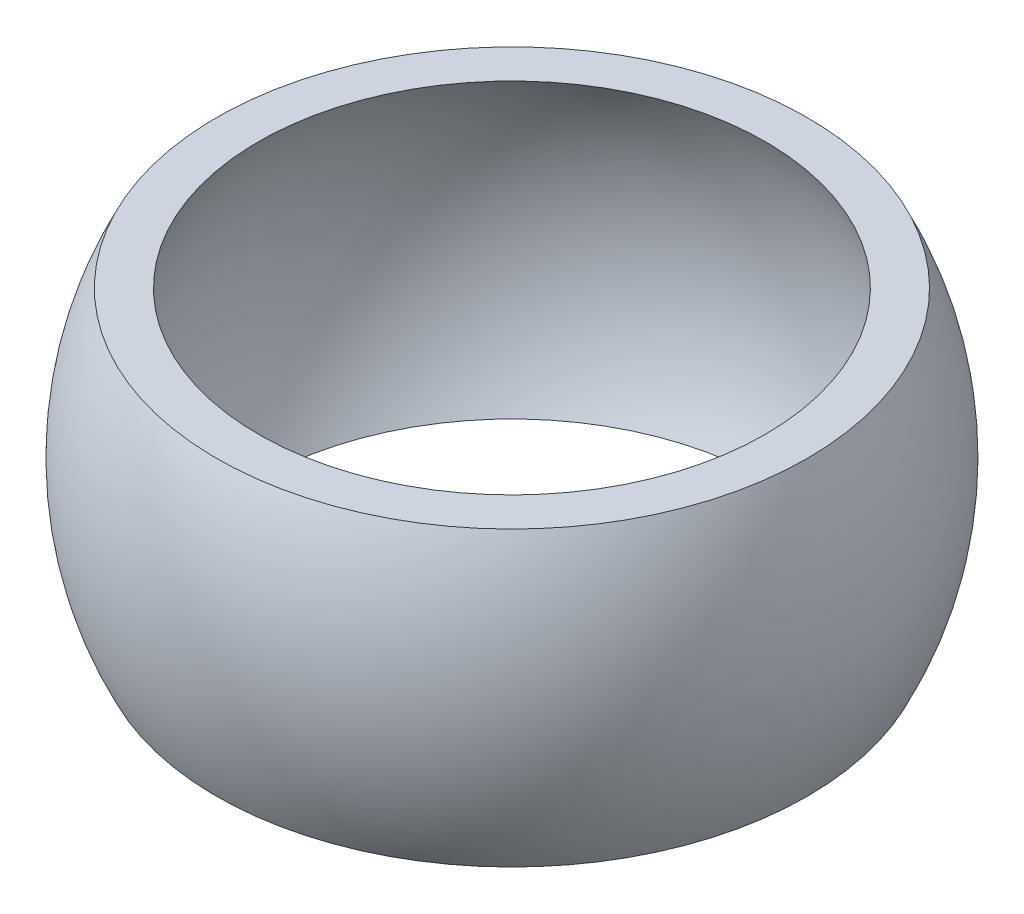
ISO-10303-21;
HEADER;
FILE_DESCRIPTION(('STEP AP214'),'2;1');
FILE_NAME('part.step','',(''),(''),'','','');
FILE_SCHEMA(('AUTOMOTIVE_DESIGN { 1 0 10303 214 1 1 1 1 }'));
ENDSEC;
DATA;
#1=APPLICATION_CONTEXT('core data for automotive mechanical design processes');
#2=APPLICATION_PROTOCOL_DEFINITION('international standard','automotive_design',2000,#1);
#3=PRODUCT_CONTEXT('',#1,'mechanical');
#4=PRODUCT('Part','Part','',(#3));
#5=PRODUCT_RELATED_PRODUCT_CATEGORY('part','',(#4));
#6=PRODUCT_DEFINITION_FORMATION('','',#4);
#7=PRODUCT_DEFINITION_CONTEXT('part definition',#1,'design');
#8=PRODUCT_DEFINITION('design','',#6,#7);
#9=PRODUCT_DEFINITION_SHAPE('','',#8);
#10=(LENGTH_UNIT() NAMED_UNIT(*) SI_UNIT(.MILLI.,.METRE.));
#11=(NAMED_UNIT(*) PLANE_ANGLE_UNIT() SI_UNIT($,.RADIAN.));
#12=(NAMED_UNIT(*) SI_UNIT($,.STERADIAN.) SOLID_ANGLE_UNIT());
#13=UNCERTAINTY_MEASURE_WITH_UNIT(LENGTH_MEASURE(1.E-05),#10,'distance_accuracy_value','');
#14=(GEOMETRIC_REPRESENTATION_CONTEXT(3) GLOBAL_UNCERTAINTY_ASSIGNED_CONTEXT((#13)) GLOBAL_UNIT_ASSIGNED_CONTEXT((#10,
#11,#12)) REPRESENTATION_CONTEXT('',''));
#15=CARTESIAN_POINT('',(0.,0.,0.));
#16=DIRECTION('',(0.,0.,1.));
#17=DIRECTION('',(1.,0.,0.));
#18=AXIS2_PLACEMENT_3D('',#15,#16,#17);
#19=CARTESIAN_POINT('',(0.,0.,0.));
#20=DIRECTION('',(0.,-1.,0.));
#21=DIRECTION('',(1.,0.,0.));
#22=AXIS2_PLACEMENT_3D('',#19,#20,#21);
#23=SPHERICAL_SURFACE('',#22,14.);
#24=CARTESIAN_POINT('',(0.,-7.,0.));
#25=DIRECTION('',(0.,-1.,0.));
#26=DIRECTION('',(0.,0.,-1.));
#27=AXIS2_PLACEMENT_3D('',#24,#25,#26);
#28=CIRCLE('',#27,12.1243556529821);
#29=CARTESIAN_POINT('',(12.1243556529821,-7.,0.));
#30=VERTEX_POINT('',#29);
#31=EDGE_CURVE('E46',#30,#30,#28,.T.);
#32=CARTESIAN_POINT('',(0.,7.,0.));
#33=DIRECTION('',(0.,-1.,0.));
#34=DIRECTION('',(0.,0.,-1.));
#35=AXIS2_PLACEMENT_3D('',#32,#33,#34);
#36=CIRCLE('',#35,12.1243556529821);
#37=CARTESIAN_POINT('',(12.1243556529821,7.,0.));
#38=VERTEX_POINT('',#37);
#39=EDGE_CURVE('E10',#38,#38,#36,.T.);
#40=CARTESIAN_POINT('',(12.1243556529821,-7.,0.));
#41=CARTESIAN_POINT('',(12.2007146548037,-6.86774425021675,0.));
#42=CARTESIAN_POINT('',(12.2749079584499,-6.73423819689552,0.));
#43=CARTESIAN_POINT('',(12.4188874433041,-6.46487043423242,0.));
#44=CARTESIAN_POINT('',(12.4886736245122,-6.32900872489055,0.));
#45=CARTESIAN_POINT('',(12.6237631384031,-6.05507460124149,0.));
#46=CARTESIAN_POINT('',(12.689066471086,-5.91700218693429,0.));
#47=CARTESIAN_POINT('',(12.8151206267069,-5.63879464758876,0.));
#48=CARTESIAN_POINT('',(12.875871449645,-5.49865952255043,0.));
#49=CARTESIAN_POINT('',(12.992755460671,-5.21647658367209,0.));
#50=CARTESIAN_POINT('',(13.0488886487588,-5.07442876983209,0.));
#51=CARTESIAN_POINT('',(13.1564773004463,-4.78857257196245,0.));
#52=CARTESIAN_POINT('',(13.207932764046,-4.64476418793282,0.));
#53=CARTESIAN_POINT('',(13.306110861817,-4.35554084055571,0.));
#54=CARTESIAN_POINT('',(13.3528334959884,-4.21012587720823,0.));
#55=CARTESIAN_POINT('',(13.4414959045135,-3.91784508591672,0.));
#56=CARTESIAN_POINT('',(13.4834356788671,-3.77097925797268,0.));
#57=CARTESIAN_POINT('',(13.5624874572268,-3.4759540048979,0.));
#58=CARTESIAN_POINT('',(13.5995994612328,-3.32779457976717,0.));
#59=CARTESIAN_POINT('',(13.6689559585326,-3.03034078519528,0.));
#60=CARTESIAN_POINT('',(13.7012004518263,-2.88104641575413,0.));
#61=CARTESIAN_POINT('',(13.7607873994641,-2.58148260069746,0.));
#62=CARTESIAN_POINT('',(13.7881298538081,-2.43121315508194,0.));
#63=CARTESIAN_POINT('',(13.8378834445685,-2.12986009996654,0.));
#64=CARTESIAN_POINT('',(13.8602945809849,-1.97877649046666,0.));
#65=CARTESIAN_POINT('',(13.9001615374818,-1.67595689169479,0.));
#66=CARTESIAN_POINT('',(13.9176173575624,-1.5242209024228,0.));
#67=CARTESIAN_POINT('',(13.9475549892591,-1.22025902680489,0.));
#68=CARTESIAN_POINT('',(13.9600368008751,-1.06803314045897,0.));
#69=CARTESIAN_POINT('',(13.9800130498058,-0.76325447798504,0.));
#70=CARTESIAN_POINT('',(13.9875074871206,-0.61070170185704,0.));
#71=CARTESIAN_POINT('',(13.9975009622177,-0.305432617152693,0.));
#72=CARTESIAN_POINT('',(14.,-0.152716308576346,0.));
#73=CARTESIAN_POINT('',(14.,0.152716308576346,0.));
#74=CARTESIAN_POINT('',(13.9975009622177,0.305432617152692,0.));
#75=CARTESIAN_POINT('',(13.9875074871206,0.610701701857039,0.));
#76=CARTESIAN_POINT('',(13.9800130498058,0.76325447798504,0.));
#77=CARTESIAN_POINT('',(13.9600368008751,1.06803314045897,0.));
#78=CARTESIAN_POINT('',(13.9475549892591,1.22025902680489,0.));
#79=CARTESIAN_POINT('',(13.9176173575624,1.5242209024228,0.));
#80=CARTESIAN_POINT('',(13.9001615374818,1.67595689169479,0.));
#81=CARTESIAN_POINT('',(13.8602945809849,1.97877649046666,0.));
#82=CARTESIAN_POINT('',(13.8378834445685,2.12986009996654,0.));
#83=CARTESIAN_POINT('',(13.7881298538081,2.43121315508194,0.));
#84=CARTESIAN_POINT('',(13.7607873994641,2.58148260069746,0.));
#85=CARTESIAN_POINT('',(13.7012004518263,2.88104641575413,0.));
#86=CARTESIAN_POINT('',(13.6689559585326,3.03034078519528,0.));
#87=CARTESIAN_POINT('',(13.5995994612328,3.32779457976717,0.));
#88=CARTESIAN_POINT('',(13.5624874572268,3.4759540048979,0.));
#89=CARTESIAN_POINT('',(13.4834356788671,3.77097925797268,0.));
#90=CARTESIAN_POINT('',(13.4414959045135,3.91784508591672,0.));
#91=CARTESIAN_POINT('',(13.3528334959884,4.21012587720823,0.));
#92=CARTESIAN_POINT('',(13.306110861817,4.35554084055571,0.));
#93=CARTESIAN_POINT('',(13.207932764046,4.64476418793282,0.));
#94=CARTESIAN_POINT('',(13.1564773004463,4.78857257196245,0.));
#95=CARTESIAN_POINT('',(13.0488886487588,5.07442876983209,0.));
#96=CARTESIAN_POINT('',(12.992755460671,5.21647658367209,0.));
#97=CARTESIAN_POINT('',(12.875871449645,5.49865952255043,0.));
#98=CARTESIAN_POINT('',(12.8151206267069,5.63879464758876,0.));
#99=CARTESIAN_POINT('',(12.689066471086,5.91700218693429,0.));
#100=CARTESIAN_POINT('',(12.6237631384031,6.05507460124149,0.));
#101=CARTESIAN_POINT('',(12.4886736245122,6.32900872489055,0.));
#102=CARTESIAN_POINT('',(12.4188874433041,6.46487043423242,0.));
#103=CARTESIAN_POINT('',(12.2749079584499,6.73423819689552,0.));
#104=CARTESIAN_POINT('',(12.2007146548037,6.86774425021675,0.));
#105=CARTESIAN_POINT('',(12.1243556529821,7.,0.));
#106=B_SPLINE_CURVE_WITH_KNOTS('',3,(#40,#41,#42,#43,#44,#45,#46,#47,#48,#49,#50,#51,#52,#53,
#54,#55,#56,#57,#58,#59,#60,#61,#62,#63,#64,#65,#66,#67,#68,#69,#70,#71,#72,#73,#74,#75,#76,#77,
#78,#79,#80,#81,#82,#83,#84,#85,#86,#87,#88,#89,#90,#91,#92,#93,#94,#95,#96,#97,#98,#99,#100,
#101,#102,#103,#104,#105),.UNSPECIFIED.,.F.,.F.,(4,2,2,2,2,2,2,2,2,2,2,2,2,2,2,2,2,2,2,2,2,2,2,
2,2,2,2,2,2,2,2,2,4),(0.,0.45812848554163,0.916256971083259,1.37438545662489,1.83251394216652,
2.29064242770815,2.74877091324978,3.20689939879141,3.66502788433304,4.12315636987467,
4.5812848554163,5.03941334095793,5.49754182649956,5.95567031204119,6.41379879758282,
6.87192728312445,7.33005576866608,7.78818425420771,8.24631273974934,8.70444122529097,
9.1625697108326,9.62069819637423,10.0788266819159,10.5369551674575,10.9950836529991,
11.4532121385408,11.9113406240824,12.369469109624,12.8275975951656,13.2857260807073,
13.7438545662489,14.2019830517905,14.6601115373322),.UNSPECIFIED.);
#107=EDGE_CURVE('BSEAM32',#30,#38,#106,.T.);
#108=ORIENTED_EDGE('',*,*,#31,.T.);
#109=ORIENTED_EDGE('',*,*,#39,.F.);
#110=ORIENTED_EDGE('',*,*,#107,.T.);
#111=ORIENTED_EDGE('',*,*,#107,.F.);
#112=EDGE_LOOP('',(#108,#110,#109,#111));
#113=FACE_BOUND('',#112,.T.);
#114=ADVANCED_FACE('F32',(#113),#23,.F.);
#115=CARTESIAN_POINT('',(12.1243556529821,7.,0.));
#116=DIRECTION('',(0.,1.,0.));
#117=DIRECTION('',(0.,0.,1.));
#118=AXIS2_PLACEMENT_3D('',#115,#116,#117);
#119=PLANE('',#118);
#120=ORIENTED_EDGE('',*,*,#39,.T.);
#121=EDGE_LOOP('',(#120));
#122=FACE_BOUND('',#121,.T.);
#123=CARTESIAN_POINT('',(0.,7.,0.));
#124=DIRECTION('',(0.,-1.,0.));
#125=DIRECTION('',(0.,0.,-1.));
#126=AXIS2_PLACEMENT_3D('',#123,#124,#125);
#127=CIRCLE('',#126,14.1243556529821);
#128=CARTESIAN_POINT('',(14.1243556529821,7.,0.));
#129=VERTEX_POINT('',#128);
#130=EDGE_CURVE('E38',#129,#129,#127,.T.);
#131=ORIENTED_EDGE('',*,*,#130,.F.);
#132=EDGE_LOOP('',(#131));
#133=FACE_BOUND('',#132,.T.);
#134=ADVANCED_FACE('F62',(#122,#133),#119,.T.);
#135=CARTESIAN_POINT('',(0.,0.,0.));
#136=DIRECTION('',(0.,-1.,0.));
#137=DIRECTION('',(1.,0.,0.));
#138=AXIS2_PLACEMENT_3D('',#135,#136,#137);
#139=SPHERICAL_SURFACE('',#138,15.7638010204369);
#140=CARTESIAN_POINT('',(0.,-7.,0.));
#141=DIRECTION('',(0.,-1.,0.));
#142=DIRECTION('',(0.,0.,-1.));
#143=AXIS2_PLACEMENT_3D('',#140,#141,#142);
#144=CIRCLE('',#143,14.1243556529821);
#145=CARTESIAN_POINT('',(14.1243556529821,-7.,0.));
#146=VERTEX_POINT('',#145);
#147=EDGE_CURVE('E42',#146,#146,#144,.T.);
#148=CARTESIAN_POINT('',(14.1243556529821,7.,0.));
#149=CARTESIAN_POINT('',(14.1914570247945,6.86460664679845,0.));
#150=CARTESIAN_POINT('',(14.2566104574723,6.72824793505724,0.));
#151=CARTESIAN_POINT('',(14.3829701411498,6.45371373924387,0.));
#152=CARTESIAN_POINT('',(14.4441763921496,6.31553825517172,0.));
#153=CARTESIAN_POINT('',(14.5625904090622,6.03748445944487,0.));
#154=CARTESIAN_POINT('',(14.6197981749751,5.89760614779018,0.));
#155=CARTESIAN_POINT('',(14.7301680993987,5.61626245232996,0.));
#156=CARTESIAN_POINT('',(14.7833302579095,5.47479706852443,0.));
#157=CARTESIAN_POINT('',(14.885564956321,5.19039618873662,0.));
#158=CARTESIAN_POINT('',(14.9346374962219,5.04746069275435,0.));
#159=CARTESIAN_POINT('',(15.0286523908511,4.76023779317742,0.));
#160=CARTESIAN_POINT('',(15.0735947455794,4.61595038958277,0.));
#161=CARTESIAN_POINT('',(15.1593121018729,4.32614298954174,0.));
#162=CARTESIAN_POINT('',(15.2000871034381,4.18062299309537,0.));
#163=CARTESIAN_POINT('',(15.2774360360556,3.88847074346161,0.));
#164=CARTESIAN_POINT('',(15.314009967108,3.74183849027422,0.));
#165=CARTESIAN_POINT('',(15.3829265141575,3.44758298247788,0.));
#166=CARTESIAN_POINT('',(15.4152691301545,3.29995972786891,0.));
#167=CARTESIAN_POINT('',(15.4756963018998,3.00384429219223,0.));
#168=CARTESIAN_POINT('',(15.5037808576479,2.8553521111245,0.));
#169=CARTESIAN_POINT('',(15.5556686847567,2.55762161599946,0.));
#170=CARTESIAN_POINT('',(15.5794719561174,2.40838330194214,0.));
#171=CARTESIAN_POINT('',(15.6227775306825,2.10928395132173,0.));
#172=CARTESIAN_POINT('',(15.642279833887,1.95942291475864,0.));
#173=CARTESIAN_POINT('',(15.6769673449888,1.65920204455908,0.));
#174=CARTESIAN_POINT('',(15.6921525528861,1.5088422109226,0.));
#175=CARTESIAN_POINT('',(15.7181933161842,1.20774808448252,0.));
#176=CARTESIAN_POINT('',(15.7290488715851,1.05701379167892,0.));
#177=CARTESIAN_POINT('',(15.7464213530444,0.755295394464233,0.));
#178=CARTESIAN_POINT('',(15.7529382791029,0.604311290053158,0.));
#179=CARTESIAN_POINT('',(15.7616281127992,0.302218123761388,0.));
#180=CARTESIAN_POINT('',(15.7638010204369,0.151109061880694,0.));
#181=CARTESIAN_POINT('',(15.7638010204369,-0.151109061880695,0.));
#182=CARTESIAN_POINT('',(15.7616281127992,-0.30221812376139,0.));
#183=CARTESIAN_POINT('',(15.7529382791029,-0.60431129005316,0.));
#184=CARTESIAN_POINT('',(15.7464213530444,-0.755295394464235,0.));
#185=CARTESIAN_POINT('',(15.7290488715851,-1.05701379167892,0.));
#186=CARTESIAN_POINT('',(15.7181933161842,-1.20774808448253,0.));
#187=CARTESIAN_POINT('',(15.6921525528861,-1.50884221092261,0.));
#188=CARTESIAN_POINT('',(15.6769673449888,-1.65920204455908,0.));
#189=CARTESIAN_POINT('',(15.642279833887,-1.95942291475864,0.));
#190=CARTESIAN_POINT('',(15.6227775306825,-2.10928395132173,0.));
#191=CARTESIAN_POINT('',(15.5794719561174,-2.40838330194214,0.));
#192=CARTESIAN_POINT('',(15.5556686847567,-2.55762161599946,0.));
#193=CARTESIAN_POINT('',(15.5037808576479,-2.85535211112451,0.));
#194=CARTESIAN_POINT('',(15.4756963018998,-3.00384429219223,0.));
#195=CARTESIAN_POINT('',(15.4152691301545,-3.29995972786891,0.));
#196=CARTESIAN_POINT('',(15.3829265141575,-3.44758298247788,0.));
#197=CARTESIAN_POINT('',(15.314009967108,-3.74183849027423,0.));
#198=CARTESIAN_POINT('',(15.2774360360556,-3.88847074346161,0.));
#199=CARTESIAN_POINT('',(15.2000871034381,-4.18062299309537,0.));
#200=CARTESIAN_POINT('',(15.1593121018729,-4.32614298954174,0.));
#201=CARTESIAN_POINT('',(15.0735947455794,-4.61595038958277,0.));
#202=CARTESIAN_POINT('',(15.0286523908511,-4.76023779317742,0.));
#203=CARTESIAN_POINT('',(14.9346374962219,-5.04746069275435,0.));
#204=CARTESIAN_POINT('',(14.885564956321,-5.19039618873662,0.));
#205=CARTESIAN_POINT('',(14.7833302579095,-5.47479706852443,0.));
#206=CARTESIAN_POINT('',(14.7301680993987,-5.61626245232996,0.));
#207=CARTESIAN_POINT('',(14.6197981749751,-5.89760614779018,0.));
#208=CARTESIAN_POINT('',(14.5625904090622,-6.03748445944488,0.));
#209=CARTESIAN_POINT('',(14.4441763921496,-6.31553825517172,0.));
#210=CARTESIAN_POINT('',(14.3829701411498,-6.45371373924387,0.));
#211=CARTESIAN_POINT('',(14.2566104574723,-6.72824793505724,0.));
#212=CARTESIAN_POINT('',(14.1914570247945,-6.86460664679845,0.));
#213=CARTESIAN_POINT('',(14.1243556529821,-7.,0.));
#214=B_SPLINE_CURVE_WITH_KNOTS('',3,(#148,#149,#150,#151,#152,#153,#154,#155,#156,#157,#158,
#159,#160,#161,#162,#163,#164,#165,#166,#167,#168,#169,#170,#171,#172,#173,#174,#175,#176,#177,
#178,#179,#180,#181,#182,#183,#184,#185,#186,#187,#188,#189,#190,#191,#192,#193,#194,#195,#196,
#197,#198,#199,#200,#201,#202,#203,#204,#205,#206,#207,#208,#209,#210,#211,#212,#213),
.UNSPECIFIED.,.F.,.F.,(4,2,2,2,2,2,2,2,2,2,2,2,2,2,2,2,2,2,2,2,2,2,2,2,2,2,2,2,2,2,2,2,4),(0.,
0.453311566765912,0.906623133531824,1.35993470029774,1.81324626706365,2.26655783382956,
2.71986940059547,3.17318096736138,3.6264925341273,4.07980410089321,4.53311566765912,
4.98642723442503,5.43973880119094,5.89305036795686,6.34636193472277,6.79967350148868,
7.25298506825459,7.7062966350205,8.15960820178642,8.61291976855233,9.06623133531824,
9.51954290208415,9.97285446885006,10.426166035616,10.8794776023819,11.3327891691478,
11.7861007359137,12.2394123026796,12.6927238694455,13.1460354362114,13.5993470029774,
14.0526585697433,14.5059701365092),.UNSPECIFIED.);
#215=EDGE_CURVE('BSEAM56',#129,#146,#214,.T.);
#216=ORIENTED_EDGE('',*,*,#130,.T.);
#217=ORIENTED_EDGE('',*,*,#147,.F.);
#218=ORIENTED_EDGE('',*,*,#215,.T.);
#219=ORIENTED_EDGE('',*,*,#215,.F.);
#220=EDGE_LOOP('',(#216,#218,#217,#219));
#221=FACE_BOUND('',#220,.T.);
#222=ADVANCED_FACE('F56',(#221),#139,.T.);
#223=CARTESIAN_POINT('',(12.1243556529821,-7.,0.));
#224=DIRECTION('',(0.,-1.,0.));
#225=DIRECTION('',(0.,0.,-1.));
#226=AXIS2_PLACEMENT_3D('',#223,#224,#225);
#227=PLANE('',#226);
#228=ORIENTED_EDGE('',*,*,#147,.T.);
#229=EDGE_LOOP('',(#228));
#230=FACE_BOUND('',#229,.T.);
#231=ORIENTED_EDGE('',*,*,#31,.F.);
#232=EDGE_LOOP('',(#231));
#233=FACE_BOUND('',#232,.T.);
#234=ADVANCED_FACE('F54',(#230,#233),#227,.T.);
#235=CLOSED_SHELL('',(#114,#134,#222,#234));
#236=MANIFOLD_SOLID_BREP('B2',#235);
#237=ADVANCED_BREP_SHAPE_REPRESENTATION('',(#18,#236),#14);
#238=SHAPE_DEFINITION_REPRESENTATION(#9,#237);
ENDSEC;
END-ISO-10303-21;
